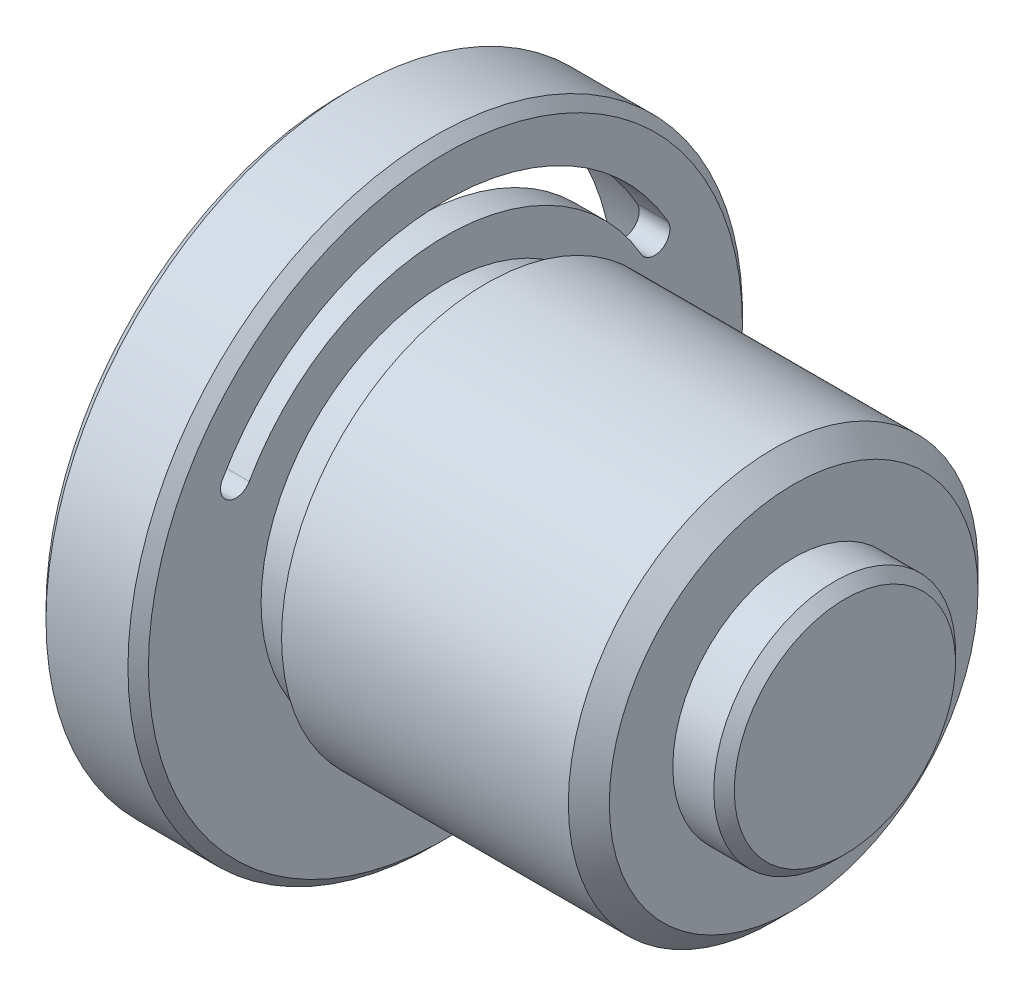
ISO-10303-21;
HEADER;
FILE_DESCRIPTION(('STEP AP214'),'2;1');
FILE_NAME('part.step','',(''),(''),'','','');
FILE_SCHEMA(('AUTOMOTIVE_DESIGN { 1 0 10303 214 1 1 1 1 }'));
ENDSEC;
DATA;
#1=APPLICATION_CONTEXT('core data for automotive mechanical design processes');
#2=APPLICATION_PROTOCOL_DEFINITION('international standard','automotive_design',2000,#1);
#3=PRODUCT_CONTEXT('',#1,'mechanical');
#4=PRODUCT('Part','Part','',(#3));
#5=PRODUCT_RELATED_PRODUCT_CATEGORY('part','',(#4));
#6=PRODUCT_DEFINITION_FORMATION('','',#4);
#7=PRODUCT_DEFINITION_CONTEXT('part definition',#1,'design');
#8=PRODUCT_DEFINITION('design','',#6,#7);
#9=PRODUCT_DEFINITION_SHAPE('','',#8);
#10=(LENGTH_UNIT() NAMED_UNIT(*) SI_UNIT(.MILLI.,.METRE.));
#11=(NAMED_UNIT(*) PLANE_ANGLE_UNIT() SI_UNIT($,.RADIAN.));
#12=(NAMED_UNIT(*) SI_UNIT($,.STERADIAN.) SOLID_ANGLE_UNIT());
#13=UNCERTAINTY_MEASURE_WITH_UNIT(LENGTH_MEASURE(1.E-05),#10,'distance_accuracy_value','');
#14=(GEOMETRIC_REPRESENTATION_CONTEXT(3) GLOBAL_UNCERTAINTY_ASSIGNED_CONTEXT((#13)) GLOBAL_UNIT_ASSIGNED_CONTEXT((#10,
#11,#12)) REPRESENTATION_CONTEXT('',''));
#15=CARTESIAN_POINT('',(0.,0.,0.));
#16=DIRECTION('',(0.,0.,1.));
#17=DIRECTION('',(1.,0.,0.));
#18=AXIS2_PLACEMENT_3D('',#15,#16,#17);
#19=CARTESIAN_POINT('',(-19.5,9.,0.));
#20=DIRECTION('',(-1.,0.,0.));
#21=DIRECTION('',(0.,0.,1.));
#22=AXIS2_PLACEMENT_3D('',#19,#20,#21);
#23=PLANE('',#22);
#24=CARTESIAN_POINT('',(-19.5,0.,0.));
#25=DIRECTION('',(-1.,0.,0.));
#26=DIRECTION('',(0.,0.,1.));
#27=AXIS2_PLACEMENT_3D('',#24,#25,#26);
#28=CIRCLE('',#27,14.5);
#29=CARTESIAN_POINT('',(-19.5,0.,14.5));
#30=VERTEX_POINT('',#29);
#31=EDGE_CURVE('E146',#30,#30,#28,.F.);
#32=ORIENTED_EDGE('',*,*,#31,.T.);
#33=EDGE_LOOP('',(#32));
#34=FACE_BOUND('',#33,.T.);
#35=CARTESIAN_POINT('',(-19.5,0.,0.));
#36=DIRECTION('',(-1.,0.,0.));
#37=DIRECTION('',(0.,0.,1.));
#38=AXIS2_PLACEMENT_3D('',#35,#36,#37);
#39=CIRCLE('',#38,9.);
#40=CARTESIAN_POINT('',(-19.5,0.,9.));
#41=VERTEX_POINT('',#40);
#42=EDGE_CURVE('E113',#41,#41,#39,.T.);
#43=ORIENTED_EDGE('',*,*,#42,.T.);
#44=EDGE_LOOP('',(#43));
#45=FACE_BOUND('',#44,.T.);
#46=CARTESIAN_POINT('',(-19.5,5.81961441498023,-10.2075718754256));
#47=DIRECTION('',(-1.,0.,0.));
#48=DIRECTION('',(0.,0.,1.));
#49=AXIS2_PLACEMENT_3D('',#46,#47,#48);
#50=CIRCLE('',#49,0.750042978085496);
#51=CARTESIAN_POINT('',(-19.5,5.44118846095825,-9.5599931031531));
#52=VERTEX_POINT('',#51);
#53=CARTESIAN_POINT('',(-19.5,6.18411830765752,-10.8630879936091));
#54=VERTEX_POINT('',#53);
#55=EDGE_CURVE('E108',#52,#54,#50,.F.);
#56=ORIENTED_EDGE('',*,*,#55,.F.);
#57=CARTESIAN_POINT('',(-19.5,0.,0.));
#58=DIRECTION('',(-1.,0.,0.));
#59=DIRECTION('',(0.,0.,1.));
#60=AXIS2_PLACEMENT_3D('',#57,#58,#59);
#61=CIRCLE('',#60,11.);
#62=CARTESIAN_POINT('',(-19.5,5.40922592970357,9.57811436773557));
#63=VERTEX_POINT('',#62);
#64=EDGE_CURVE('E100',#63,#52,#61,.T.);
#65=ORIENTED_EDGE('',*,*,#64,.F.);
#66=CARTESIAN_POINT('',(-19.5,5.78081428537752,10.2295980977472));
#67=DIRECTION('',(-1.,0.,0.));
#68=DIRECTION('',(0.,0.,1.));
#69=AXIS2_PLACEMENT_3D('',#66,#67,#68);
#70=CIRCLE('',#69,0.750005971004445);
#71=CARTESIAN_POINT('',(-19.5,6.15240264105147,10.8810818277588));
#72=VERTEX_POINT('',#71);
#73=EDGE_CURVE('E81',#72,#63,#70,.F.);
#74=ORIENTED_EDGE('',*,*,#73,.F.);
#75=CARTESIAN_POINT('',(-19.5,0.,0.));
#76=DIRECTION('',(-1.,0.,0.));
#77=DIRECTION('',(0.,0.,1.));
#78=AXIS2_PLACEMENT_3D('',#75,#76,#77);
#79=CIRCLE('',#78,12.5);
#80=EDGE_CURVE('E105',#72,#54,#79,.T.);
#81=ORIENTED_EDGE('',*,*,#80,.T.);
#82=EDGE_LOOP('',(#56,#65,#74,#81));
#83=FACE_BOUND('',#82,.T.);
#84=ADVANCED_FACE('F34',(#34,#45,#83),#23,.F.);
#85=CARTESIAN_POINT('',(-21.,13.,0.));
#86=DIRECTION('',(1.,0.,0.));
#87=DIRECTION('',(0.,0.,-1.));
#88=AXIS2_PLACEMENT_3D('',#85,#86,#87);
#89=PLANE('',#88);
#90=CARTESIAN_POINT('',(-21.,0.,0.));
#91=DIRECTION('',(-1.,0.,0.));
#92=DIRECTION('',(0.,0.,1.));
#93=AXIS2_PLACEMENT_3D('',#90,#91,#92);
#94=CIRCLE('',#93,13.);
#95=CARTESIAN_POINT('',(-21.,0.,13.));
#96=VERTEX_POINT('',#95);
#97=EDGE_CURVE('E110',#96,#96,#94,.T.);
#98=ORIENTED_EDGE('',*,*,#97,.T.);
#99=EDGE_LOOP('',(#98));
#100=FACE_BOUND('',#99,.T.);
#101=CARTESIAN_POINT('',(-21.,5.81961441498023,-10.2075718754256));
#102=DIRECTION('',(-1.,0.,0.));
#103=DIRECTION('',(0.,0.,1.));
#104=AXIS2_PLACEMENT_3D('',#101,#102,#103);
#105=CIRCLE('',#104,0.750042978085496);
#106=CARTESIAN_POINT('',(-21.,5.44118846095825,-9.5599931031531));
#107=VERTEX_POINT('',#106);
#108=CARTESIAN_POINT('',(-21.,6.18411830765752,-10.8630879936091));
#109=VERTEX_POINT('',#108);
#110=EDGE_CURVE('E57',#107,#109,#105,.F.);
#111=ORIENTED_EDGE('',*,*,#110,.T.);
#112=CARTESIAN_POINT('',(-21.,0.,0.));
#113=DIRECTION('',(-1.,0.,0.));
#114=DIRECTION('',(0.,0.,1.));
#115=AXIS2_PLACEMENT_3D('',#112,#113,#114);
#116=CIRCLE('',#115,12.5);
#117=CARTESIAN_POINT('',(-21.,6.15240264105147,10.8810818277588));
#118=VERTEX_POINT('',#117);
#119=EDGE_CURVE('E93',#118,#109,#116,.T.);
#120=ORIENTED_EDGE('',*,*,#119,.F.);
#121=CARTESIAN_POINT('',(-21.,5.78081428537752,10.2295980977472));
#122=DIRECTION('',(-1.,0.,0.));
#123=DIRECTION('',(0.,0.,1.));
#124=AXIS2_PLACEMENT_3D('',#121,#122,#123);
#125=CIRCLE('',#124,0.750005971004445);
#126=CARTESIAN_POINT('',(-21.,5.40922592970357,9.57811436773557));
#127=VERTEX_POINT('',#126);
#128=EDGE_CURVE('E78',#118,#127,#125,.F.);
#129=ORIENTED_EDGE('',*,*,#128,.T.);
#130=CARTESIAN_POINT('',(-21.,0.,0.));
#131=DIRECTION('',(-1.,0.,0.));
#132=DIRECTION('',(0.,0.,1.));
#133=AXIS2_PLACEMENT_3D('',#130,#131,#132);
#134=CIRCLE('',#133,11.);
#135=EDGE_CURVE('E87',#127,#107,#134,.T.);
#136=ORIENTED_EDGE('',*,*,#135,.T.);
#137=EDGE_LOOP('',(#111,#120,#129,#136));
#138=FACE_BOUND('',#137,.T.);
#139=ADVANCED_FACE('F91',(#100,#138),#89,.F.);
#140=CARTESIAN_POINT('',(0.,0.,0.));
#141=DIRECTION('',(-1.,0.,0.));
#142=DIRECTION('',(0.,0.,1.));
#143=AXIS2_PLACEMENT_3D('',#140,#141,#142);
#144=PLANE('',#143);
#145=CARTESIAN_POINT('',(0.,0.,0.));
#146=DIRECTION('',(-1.,0.,0.));
#147=DIRECTION('',(0.,0.,1.));
#148=AXIS2_PLACEMENT_3D('',#145,#146,#147);
#149=CIRCLE('',#148,5.4);
#150=CARTESIAN_POINT('',(0.,0.,5.4));
#151=VERTEX_POINT('',#150);
#152=EDGE_CURVE('E134',#151,#151,#149,.F.);
#153=ORIENTED_EDGE('',*,*,#152,.T.);
#154=EDGE_LOOP('',(#153));
#155=FACE_BOUND('',#154,.T.);
#156=ADVANCED_FACE('F169',(#155),#144,.F.);
#157=CARTESIAN_POINT('',(-24.5,0.,0.));
#158=DIRECTION('',(-1.,0.,0.));
#159=DIRECTION('',(0.,0.,1.));
#160=AXIS2_PLACEMENT_3D('',#157,#158,#159);
#161=CYLINDRICAL_SURFACE('',#160,5.9);
#162=CARTESIAN_POINT('',(-0.499999999999994,0.,0.));
#163=DIRECTION('',(-1.,0.,0.));
#164=DIRECTION('',(0.,0.,1.));
#165=AXIS2_PLACEMENT_3D('',#162,#163,#164);
#166=CIRCLE('',#165,5.9);
#167=CARTESIAN_POINT('',(-0.499999999999994,0.,5.9));
#168=VERTEX_POINT('',#167);
#169=EDGE_CURVE('E131',#168,#168,#166,.T.);
#170=ORIENTED_EDGE('',*,*,#169,.T.);
#171=EDGE_LOOP('',(#170));
#172=FACE_BOUND('',#171,.T.);
#173=CARTESIAN_POINT('',(-2.5,0.,0.));
#174=DIRECTION('',(-1.,0.,0.));
#175=DIRECTION('',(0.,0.,1.));
#176=AXIS2_PLACEMENT_3D('',#173,#174,#175);
#177=CIRCLE('',#176,5.9);
#178=CARTESIAN_POINT('',(-2.5,0.,5.9));
#179=VERTEX_POINT('',#178);
#180=EDGE_CURVE('E122',#179,#179,#177,.T.);
#181=ORIENTED_EDGE('',*,*,#180,.F.);
#182=EDGE_LOOP('',(#181));
#183=FACE_BOUND('',#182,.T.);
#184=ADVANCED_FACE('F192',(#172,#183),#161,.T.);
#185=CARTESIAN_POINT('',(-2.5,5.9,0.));
#186=DIRECTION('',(-1.,0.,0.));
#187=DIRECTION('',(0.,0.,1.));
#188=AXIS2_PLACEMENT_3D('',#185,#186,#187);
#189=PLANE('',#188);
#190=CARTESIAN_POINT('',(-2.5,0.,0.));
#191=DIRECTION('',(-1.,0.,0.));
#192=DIRECTION('',(0.,0.,1.));
#193=AXIS2_PLACEMENT_3D('',#190,#191,#192);
#194=CIRCLE('',#193,9.00000000000001);
#195=CARTESIAN_POINT('',(-2.5,0.,9.00000000000001));
#196=VERTEX_POINT('',#195);
#197=EDGE_CURVE('E128',#196,#196,#194,.F.);
#198=ORIENTED_EDGE('',*,*,#197,.T.);
#199=EDGE_LOOP('',(#198));
#200=FACE_BOUND('',#199,.T.);
#201=ORIENTED_EDGE('',*,*,#180,.T.);
#202=EDGE_LOOP('',(#201));
#203=FACE_BOUND('',#202,.T.);
#204=ADVANCED_FACE('F188',(#200,#203),#189,.F.);
#205=CARTESIAN_POINT('',(-24.5,0.,0.));
#206=DIRECTION('',(-1.,0.,0.));
#207=DIRECTION('',(0.,0.,1.));
#208=AXIS2_PLACEMENT_3D('',#205,#206,#207);
#209=CYLINDRICAL_SURFACE('',#208,10.);
#210=CARTESIAN_POINT('',(-3.49999999999999,0.,0.));
#211=DIRECTION('',(-1.,0.,0.));
#212=DIRECTION('',(0.,0.,1.));
#213=AXIS2_PLACEMENT_3D('',#210,#211,#212);
#214=CIRCLE('',#213,10.);
#215=CARTESIAN_POINT('',(-3.49999999999999,0.,10.));
#216=VERTEX_POINT('',#215);
#217=EDGE_CURVE('E125',#216,#216,#214,.T.);
#218=ORIENTED_EDGE('',*,*,#217,.T.);
#219=EDGE_LOOP('',(#218));
#220=FACE_BOUND('',#219,.T.);
#221=CARTESIAN_POINT('',(-17.5,0.,0.));
#222=DIRECTION('',(-1.,0.,0.));
#223=DIRECTION('',(0.,0.,1.));
#224=AXIS2_PLACEMENT_3D('',#221,#222,#223);
#225=CIRCLE('',#224,10.);
#226=CARTESIAN_POINT('',(-17.5,0.,10.));
#227=VERTEX_POINT('',#226);
#228=EDGE_CURVE('E119',#227,#227,#225,.T.);
#229=ORIENTED_EDGE('',*,*,#228,.F.);
#230=EDGE_LOOP('',(#229));
#231=FACE_BOUND('',#230,.T.);
#232=ADVANCED_FACE('F184',(#220,#231),#209,.T.);
#233=CARTESIAN_POINT('',(-17.5,10.,0.));
#234=DIRECTION('',(1.,0.,0.));
#235=DIRECTION('',(0.,0.,-1.));
#236=AXIS2_PLACEMENT_3D('',#233,#234,#235);
#237=PLANE('',#236);
#238=CARTESIAN_POINT('',(-17.5,0.,0.));
#239=DIRECTION('',(-1.,0.,0.));
#240=DIRECTION('',(0.,0.,1.));
#241=AXIS2_PLACEMENT_3D('',#238,#239,#240);
#242=CIRCLE('',#241,9.);
#243=CARTESIAN_POINT('',(-17.5,0.,9.));
#244=VERTEX_POINT('',#243);
#245=EDGE_CURVE('E116',#244,#244,#242,.T.);
#246=ORIENTED_EDGE('',*,*,#245,.F.);
#247=EDGE_LOOP('',(#246));
#248=FACE_BOUND('',#247,.T.);
#249=ORIENTED_EDGE('',*,*,#228,.T.);
#250=EDGE_LOOP('',(#249));
#251=FACE_BOUND('',#250,.T.);
#252=ADVANCED_FACE('F180',(#248,#251),#237,.F.);
#253=CARTESIAN_POINT('',(-24.5,0.,0.));
#254=DIRECTION('',(-1.,0.,0.));
#255=DIRECTION('',(0.,0.,1.));
#256=AXIS2_PLACEMENT_3D('',#253,#254,#255);
#257=CYLINDRICAL_SURFACE('',#256,9.);
#258=ORIENTED_EDGE('',*,*,#42,.F.);
#259=EDGE_LOOP('',(#258));
#260=FACE_BOUND('',#259,.T.);
#261=ORIENTED_EDGE('',*,*,#245,.T.);
#262=EDGE_LOOP('',(#261));
#263=FACE_BOUND('',#262,.T.);
#264=ADVANCED_FACE('F177',(#260,#263),#257,.T.);
#265=CARTESIAN_POINT('',(-24.5,0.,0.));
#266=DIRECTION('',(-1.,0.,0.));
#267=DIRECTION('',(0.,0.,1.));
#268=AXIS2_PLACEMENT_3D('',#265,#266,#267);
#269=CYLINDRICAL_SURFACE('',#268,15.);
#270=CARTESIAN_POINT('',(-24.,0.,0.));
#271=DIRECTION('',(1.,0.,0.));
#272=DIRECTION('',(0.,0.,-1.));
#273=AXIS2_PLACEMENT_3D('',#270,#271,#272);
#274=CIRCLE('',#273,15.);
#275=CARTESIAN_POINT('',(-24.,0.,-15.));
#276=VERTEX_POINT('',#275);
#277=EDGE_CURVE('E143',#276,#276,#274,.T.);
#278=ORIENTED_EDGE('',*,*,#277,.T.);
#279=EDGE_LOOP('',(#278));
#280=FACE_BOUND('',#279,.T.);
#281=CARTESIAN_POINT('',(-20.,0.,0.));
#282=DIRECTION('',(-1.,0.,0.));
#283=DIRECTION('',(0.,0.,1.));
#284=AXIS2_PLACEMENT_3D('',#281,#282,#283);
#285=CIRCLE('',#284,15.);
#286=CARTESIAN_POINT('',(-20.,0.,15.));
#287=VERTEX_POINT('',#286);
#288=EDGE_CURVE('E140',#287,#287,#285,.T.);
#289=ORIENTED_EDGE('',*,*,#288,.T.);
#290=EDGE_LOOP('',(#289));
#291=FACE_BOUND('',#290,.T.);
#292=ADVANCED_FACE('F175',(#280,#291),#269,.T.);
#293=CARTESIAN_POINT('',(-24.5,15.,0.));
#294=DIRECTION('',(1.,0.,0.));
#295=DIRECTION('',(0.,0.,-1.));
#296=AXIS2_PLACEMENT_3D('',#293,#294,#295);
#297=PLANE('',#296);
#298=CARTESIAN_POINT('',(-24.5,0.,0.));
#299=DIRECTION('',(1.,0.,0.));
#300=DIRECTION('',(0.,0.,-1.));
#301=AXIS2_PLACEMENT_3D('',#298,#299,#300);
#302=CIRCLE('',#301,13.2);
#303=CARTESIAN_POINT('',(-24.5,0.,-13.2));
#304=VERTEX_POINT('',#303);
#305=EDGE_CURVE('E12',#304,#304,#302,.T.);
#306=ORIENTED_EDGE('',*,*,#305,.T.);
#307=EDGE_LOOP('',(#306));
#308=FACE_BOUND('',#307,.T.);
#309=CARTESIAN_POINT('',(-24.5,0.,0.));
#310=DIRECTION('',(1.,0.,0.));
#311=DIRECTION('',(0.,0.,-1.));
#312=AXIS2_PLACEMENT_3D('',#309,#310,#311);
#313=CIRCLE('',#312,14.5);
#314=CARTESIAN_POINT('',(-24.5,0.,-14.5));
#315=VERTEX_POINT('',#314);
#316=EDGE_CURVE('E137',#315,#315,#313,.F.);
#317=ORIENTED_EDGE('',*,*,#316,.T.);
#318=EDGE_LOOP('',(#317));
#319=FACE_BOUND('',#318,.T.);
#320=ADVANCED_FACE('F219',(#308,#319),#297,.F.);
#321=CARTESIAN_POINT('',(-24.5,0.,0.));
#322=DIRECTION('',(-1.,0.,0.));
#323=DIRECTION('',(0.,0.,1.));
#324=AXIS2_PLACEMENT_3D('',#321,#322,#323);
#325=CYLINDRICAL_SURFACE('',#324,13.);
#326=CARTESIAN_POINT('',(-24.3,0.,0.));
#327=DIRECTION('',(1.,0.,0.));
#328=DIRECTION('',(0.,0.,-1.));
#329=AXIS2_PLACEMENT_3D('',#326,#327,#328);
#330=CIRCLE('',#329,13.);
#331=CARTESIAN_POINT('',(-24.3,0.,-13.));
#332=VERTEX_POINT('',#331);
#333=EDGE_CURVE('E42',#332,#332,#330,.F.);
#334=ORIENTED_EDGE('',*,*,#333,.T.);
#335=EDGE_LOOP('',(#334));
#336=FACE_BOUND('',#335,.T.);
#337=ORIENTED_EDGE('',*,*,#97,.F.);
#338=EDGE_LOOP('',(#337));
#339=FACE_BOUND('',#338,.T.);
#340=ADVANCED_FACE('F151',(#336,#339),#325,.F.);
#341=CARTESIAN_POINT('',(-3.49999999999999,0.,0.));
#342=DIRECTION('',(-1.,0.,0.));
#343=DIRECTION('',(0.,0.,1.));
#344=AXIS2_PLACEMENT_3D('',#341,#342,#343);
#345=CONICAL_SURFACE('',#344,10.,0.785398163397452);
#346=ORIENTED_EDGE('',*,*,#197,.F.);
#347=EDGE_LOOP('',(#346));
#348=FACE_BOUND('',#347,.T.);
#349=ORIENTED_EDGE('',*,*,#217,.F.);
#350=EDGE_LOOP('',(#349));
#351=FACE_BOUND('',#350,.T.);
#352=ADVANCED_FACE('F200',(#348,#351),#345,.T.);
#353=CARTESIAN_POINT('',(-0.499999999999994,0.,0.));
#354=DIRECTION('',(-1.,0.,0.));
#355=DIRECTION('',(0.,0.,1.));
#356=AXIS2_PLACEMENT_3D('',#353,#354,#355);
#357=CONICAL_SURFACE('',#356,5.9,0.785398163397453);
#358=ORIENTED_EDGE('',*,*,#152,.F.);
#359=EDGE_LOOP('',(#358));
#360=FACE_BOUND('',#359,.T.);
#361=ORIENTED_EDGE('',*,*,#169,.F.);
#362=EDGE_LOOP('',(#361));
#363=FACE_BOUND('',#362,.T.);
#364=ADVANCED_FACE('F203',(#360,#363),#357,.T.);
#365=CARTESIAN_POINT('',(-11.,5.81961441498023,-10.2075718754256));
#366=DIRECTION('',(-1.,0.,0.));
#367=DIRECTION('',(0.,0.,1.));
#368=AXIS2_PLACEMENT_3D('',#365,#366,#367);
#369=CYLINDRICAL_SURFACE('',#368,0.750042978085496);
#370=ORIENTED_EDGE('',*,*,#55,.T.);
#371=DIRECTION('',(-1.,0.,0.));
#372=VECTOR('',#371,1.);
#373=CARTESIAN_POINT('',(-11.,6.18411830765752,-10.8630879936091));
#374=LINE('',#373,#372);
#375=EDGE_CURVE('E98',#54,#109,#374,.T.);
#376=ORIENTED_EDGE('',*,*,#375,.T.);
#377=ORIENTED_EDGE('',*,*,#110,.F.);
#378=DIRECTION('',(-1.,0.,0.));
#379=VECTOR('',#378,1.);
#380=CARTESIAN_POINT('',(-11.,5.44118846095825,-9.5599931031531));
#381=LINE('',#380,#379);
#382=EDGE_CURVE('E84',#52,#107,#381,.T.);
#383=ORIENTED_EDGE('',*,*,#382,.F.);
#384=EDGE_LOOP('',(#370,#376,#377,#383));
#385=FACE_BOUND('',#384,.T.);
#386=ADVANCED_FACE('F207',(#385),#369,.F.);
#387=CARTESIAN_POINT('',(-11.,0.,0.));
#388=DIRECTION('',(-1.,0.,0.));
#389=DIRECTION('',(0.,0.,1.));
#390=AXIS2_PLACEMENT_3D('',#387,#388,#389);
#391=CYLINDRICAL_SURFACE('',#390,12.5);
#392=DIRECTION('',(-1.,0.,0.));
#393=VECTOR('',#392,1.);
#394=CARTESIAN_POINT('',(-11.,6.15240264105147,10.8810818277588));
#395=LINE('',#394,#393);
#396=EDGE_CURVE('E83',#72,#118,#395,.T.);
#397=ORIENTED_EDGE('',*,*,#396,.T.);
#398=ORIENTED_EDGE('',*,*,#119,.T.);
#399=ORIENTED_EDGE('',*,*,#375,.F.);
#400=ORIENTED_EDGE('',*,*,#80,.F.);
#401=EDGE_LOOP('',(#397,#398,#399,#400));
#402=FACE_BOUND('',#401,.T.);
#403=ADVANCED_FACE('F230',(#402),#391,.F.);
#404=CARTESIAN_POINT('',(-11.,5.78081428537752,10.2295980977472));
#405=DIRECTION('',(-1.,0.,0.));
#406=DIRECTION('',(0.,0.,1.));
#407=AXIS2_PLACEMENT_3D('',#404,#405,#406);
#408=CYLINDRICAL_SURFACE('',#407,0.750005971004445);
#409=ORIENTED_EDGE('',*,*,#73,.T.);
#410=DIRECTION('',(-1.,0.,0.));
#411=VECTOR('',#410,1.);
#412=CARTESIAN_POINT('',(-11.,5.40922592970357,9.57811436773557));
#413=LINE('',#412,#411);
#414=EDGE_CURVE('E49',#63,#127,#413,.T.);
#415=ORIENTED_EDGE('',*,*,#414,.T.);
#416=ORIENTED_EDGE('',*,*,#128,.F.);
#417=ORIENTED_EDGE('',*,*,#396,.F.);
#418=EDGE_LOOP('',(#409,#415,#416,#417));
#419=FACE_BOUND('',#418,.T.);
#420=ADVANCED_FACE('F75',(#419),#408,.F.);
#421=CARTESIAN_POINT('',(-11.,0.,0.));
#422=DIRECTION('',(-1.,0.,0.));
#423=DIRECTION('',(0.,0.,1.));
#424=AXIS2_PLACEMENT_3D('',#421,#422,#423);
#425=CYLINDRICAL_SURFACE('',#424,11.);
#426=ORIENTED_EDGE('',*,*,#64,.T.);
#427=ORIENTED_EDGE('',*,*,#382,.T.);
#428=ORIENTED_EDGE('',*,*,#135,.F.);
#429=ORIENTED_EDGE('',*,*,#414,.F.);
#430=EDGE_LOOP('',(#426,#427,#428,#429));
#431=FACE_BOUND('',#430,.T.);
#432=ADVANCED_FACE('F88',(#431),#425,.T.);
#433=CARTESIAN_POINT('',(-24.5,0.,0.));
#434=DIRECTION('',(1.,0.,0.));
#435=DIRECTION('',(0.,0.,-1.));
#436=AXIS2_PLACEMENT_3D('',#433,#434,#435);
#437=CONICAL_SURFACE('',#436,14.5,0.785398163397441);
#438=ORIENTED_EDGE('',*,*,#277,.F.);
#439=EDGE_LOOP('',(#438));
#440=FACE_BOUND('',#439,.T.);
#441=ORIENTED_EDGE('',*,*,#316,.F.);
#442=EDGE_LOOP('',(#441));
#443=FACE_BOUND('',#442,.T.);
#444=ADVANCED_FACE('F160',(#440,#443),#437,.T.);
#445=CARTESIAN_POINT('',(-20.,0.,0.));
#446=DIRECTION('',(-1.,0.,0.));
#447=DIRECTION('',(0.,0.,1.));
#448=AXIS2_PLACEMENT_3D('',#445,#446,#447);
#449=CONICAL_SURFACE('',#448,15.,0.785398163397455);
#450=ORIENTED_EDGE('',*,*,#31,.F.);
#451=EDGE_LOOP('',(#450));
#452=FACE_BOUND('',#451,.T.);
#453=ORIENTED_EDGE('',*,*,#288,.F.);
#454=EDGE_LOOP('',(#453));
#455=FACE_BOUND('',#454,.T.);
#456=ADVANCED_FACE('F155',(#452,#455),#449,.T.);
#457=CARTESIAN_POINT('',(-24.3,0.,0.));
#458=DIRECTION('',(-1.,0.,0.));
#459=DIRECTION('',(0.,0.,1.));
#460=AXIS2_PLACEMENT_3D('',#457,#458,#459);
#461=CONICAL_SURFACE('',#460,13.,0.785398163397444);
#462=ORIENTED_EDGE('',*,*,#305,.F.);
#463=EDGE_LOOP('',(#462));
#464=FACE_BOUND('',#463,.T.);
#465=ORIENTED_EDGE('',*,*,#333,.F.);
#466=EDGE_LOOP('',(#465));
#467=FACE_BOUND('',#466,.T.);
#468=ADVANCED_FACE('F36',(#464,#467),#461,.F.);
#469=CLOSED_SHELL('',(#84,#139,#156,#184,#204,#232,#252,#264,#292,#320,#340,#352,#364,#386,#403,
#420,#432,#444,#456,#468));
#470=MANIFOLD_SOLID_BREP('B2',#469);
#471=ADVANCED_BREP_SHAPE_REPRESENTATION('',(#18,#470),#14);
#472=SHAPE_DEFINITION_REPRESENTATION(#9,#471);
ENDSEC;
END-ISO-10303-21;
